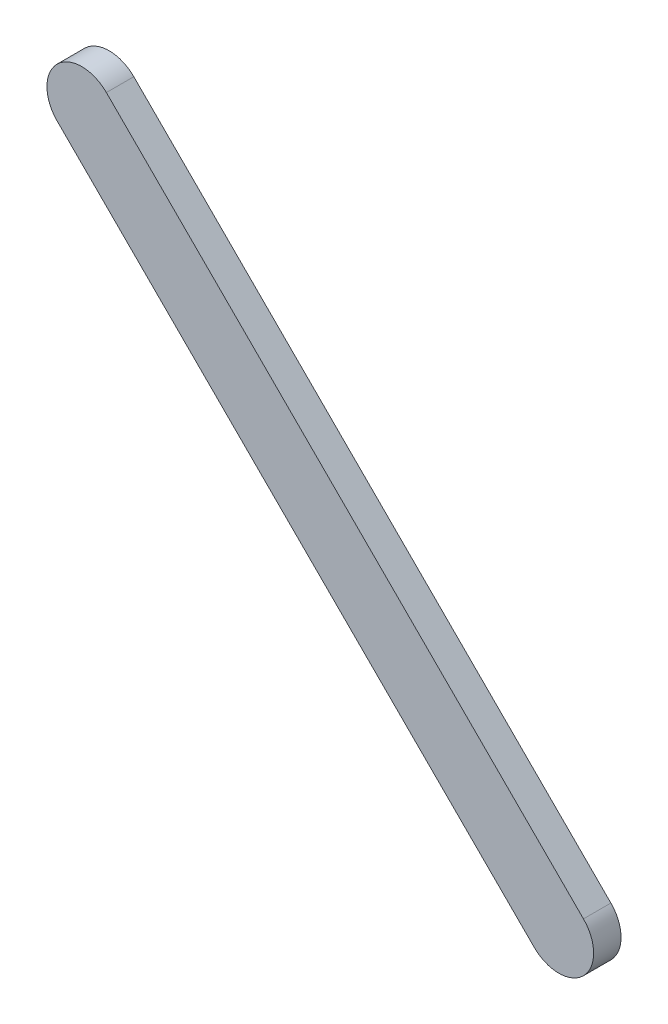
ISO-10303-21;
HEADER;
FILE_DESCRIPTION(('STEP AP214'),'2;1');
FILE_NAME('part.step','',(''),(''),'','','');
FILE_SCHEMA(('AUTOMOTIVE_DESIGN { 1 0 10303 214 1 1 1 1 }'));
ENDSEC;
DATA;
#1=APPLICATION_CONTEXT('core data for automotive mechanical design processes');
#2=APPLICATION_PROTOCOL_DEFINITION('international standard','automotive_design',2000,#1);
#3=PRODUCT_CONTEXT('',#1,'mechanical');
#4=PRODUCT('Part','Part','',(#3));
#5=PRODUCT_RELATED_PRODUCT_CATEGORY('part','',(#4));
#6=PRODUCT_DEFINITION_FORMATION('','',#4);
#7=PRODUCT_DEFINITION_CONTEXT('part definition',#1,'design');
#8=PRODUCT_DEFINITION('design','',#6,#7);
#9=PRODUCT_DEFINITION_SHAPE('','',#8);
#10=(LENGTH_UNIT() NAMED_UNIT(*) SI_UNIT(.MILLI.,.METRE.));
#11=(NAMED_UNIT(*) PLANE_ANGLE_UNIT() SI_UNIT($,.RADIAN.));
#12=(NAMED_UNIT(*) SI_UNIT($,.STERADIAN.) SOLID_ANGLE_UNIT());
#13=UNCERTAINTY_MEASURE_WITH_UNIT(LENGTH_MEASURE(1.E-05),#10,'distance_accuracy_value','');
#14=(GEOMETRIC_REPRESENTATION_CONTEXT(3) GLOBAL_UNCERTAINTY_ASSIGNED_CONTEXT((#13)) GLOBAL_UNIT_ASSIGNED_CONTEXT((#10,
#11,#12)) REPRESENTATION_CONTEXT('',''));
#15=CARTESIAN_POINT('',(0.,0.,0.));
#16=DIRECTION('',(0.,0.,1.));
#17=DIRECTION('',(1.,0.,0.));
#18=AXIS2_PLACEMENT_3D('',#15,#16,#17);
#19=CARTESIAN_POINT('',(133.1195966,107.26239406,0.));
#20=DIRECTION('',(0.707106781186548,0.707106781186548,0.));
#21=DIRECTION('',(0.707106781186548,-0.707106781186548,0.));
#22=AXIS2_PLACEMENT_3D('',#19,#20,#21);
#23=PLANE('',#22);
#24=DIRECTION('',(0.707106781186548,-0.707106781186548,0.));
#25=VECTOR('',#24,1.);
#26=CARTESIAN_POINT('',(133.1195966,107.26239406,0.1999996));
#27=LINE('',#26,#25);
#28=CARTESIAN_POINT('',(133.1195966,107.26239406,0.1999996));
#29=VERTEX_POINT('',#28);
#30=CARTESIAN_POINT('',(136.59939406,103.7825966,0.1999996));
#31=VERTEX_POINT('',#30);
#32=EDGE_CURVE('E11',#29,#31,#27,.T.);
#33=ORIENTED_EDGE('',*,*,#32,.F.);
#34=DIRECTION('',(0.,0.,1.));
#35=VECTOR('',#34,1.);
#36=CARTESIAN_POINT('',(133.1195966,107.26239406,0.));
#37=LINE('',#36,#35);
#38=CARTESIAN_POINT('',(133.1195966,107.26239406,0.));
#39=VERTEX_POINT('',#38);
#40=EDGE_CURVE('E24',#39,#29,#37,.T.);
#41=ORIENTED_EDGE('',*,*,#40,.F.);
#42=DIRECTION('',(0.707106781186548,-0.707106781186548,0.));
#43=VECTOR('',#42,1.);
#44=CARTESIAN_POINT('',(133.1195966,107.26239406,0.));
#45=LINE('',#44,#43);
#46=CARTESIAN_POINT('',(136.59939406,103.7825966,0.));
#47=VERTEX_POINT('',#46);
#48=EDGE_CURVE('E75',#39,#47,#45,.T.);
#49=ORIENTED_EDGE('',*,*,#48,.T.);
#50=DIRECTION('',(0.,0.,1.));
#51=VECTOR('',#50,1.);
#52=CARTESIAN_POINT('',(136.59939406,103.7825966,0.));
#53=LINE('',#52,#51);
#54=EDGE_CURVE('E37',#47,#31,#53,.T.);
#55=ORIENTED_EDGE('',*,*,#54,.T.);
#56=EDGE_LOOP('',(#33,#41,#49,#55));
#57=FACE_BOUND('',#56,.T.);
#58=ADVANCED_FACE('F17',(#57),#23,.F.);
#59=CARTESIAN_POINT('',(136.77899873,103.96220127,0.));
#60=DIRECTION('',(0.,0.,-1.));
#61=DIRECTION('',(-0.707106781186548,-0.707106781186548,0.));
#62=AXIS2_PLACEMENT_3D('',#59,#60,#61);
#63=CYLINDRICAL_SURFACE('',#62,0.253999360179546);
#64=CARTESIAN_POINT('',(136.77899873,103.96220127,0.1999996));
#65=DIRECTION('',(0.,0.,1.));
#66=DIRECTION('',(-0.707106781186548,-0.707106781186548,0.));
#67=AXIS2_PLACEMENT_3D('',#64,#65,#66);
#68=CIRCLE('',#67,0.253999360179546);
#69=CARTESIAN_POINT('',(136.9586034,104.14180594,0.1999996));
#70=VERTEX_POINT('',#69);
#71=EDGE_CURVE('E83',#31,#70,#68,.T.);
#72=ORIENTED_EDGE('',*,*,#71,.F.);
#73=ORIENTED_EDGE('',*,*,#54,.F.);
#74=CARTESIAN_POINT('',(136.77899873,103.96220127,0.));
#75=DIRECTION('',(0.,0.,1.));
#76=DIRECTION('',(-0.707106781186548,-0.707106781186548,0.));
#77=AXIS2_PLACEMENT_3D('',#74,#75,#76);
#78=CIRCLE('',#77,0.253999360179546);
#79=CARTESIAN_POINT('',(136.9586034,104.14180594,0.));
#80=VERTEX_POINT('',#79);
#81=EDGE_CURVE('E81',#47,#80,#78,.T.);
#82=ORIENTED_EDGE('',*,*,#81,.T.);
#83=DIRECTION('',(0.,0.,1.));
#84=VECTOR('',#83,1.);
#85=CARTESIAN_POINT('',(136.9586034,104.14180594,0.));
#86=LINE('',#85,#84);
#87=EDGE_CURVE('E67',#80,#70,#86,.T.);
#88=ORIENTED_EDGE('',*,*,#87,.T.);
#89=EDGE_LOOP('',(#72,#73,#82,#88));
#90=FACE_BOUND('',#89,.T.);
#91=ADVANCED_FACE('F89',(#90),#63,.T.);
#92=CARTESIAN_POINT('',(136.9586034,104.14180594,0.));
#93=DIRECTION('',(-0.707106781186549,-0.707106781186546,0.));
#94=DIRECTION('',(-0.707106781186546,0.707106781186549,0.));
#95=AXIS2_PLACEMENT_3D('',#92,#93,#94);
#96=PLANE('',#95);
#97=DIRECTION('',(-0.707106781186546,0.707106781186549,0.));
#98=VECTOR('',#97,1.);
#99=CARTESIAN_POINT('',(136.9586034,104.14180594,0.1999996));
#100=LINE('',#99,#98);
#101=CARTESIAN_POINT('',(133.47880594,107.6216034,0.1999996));
#102=VERTEX_POINT('',#101);
#103=EDGE_CURVE('E71',#70,#102,#100,.T.);
#104=ORIENTED_EDGE('',*,*,#103,.F.);
#105=ORIENTED_EDGE('',*,*,#87,.F.);
#106=DIRECTION('',(-0.707106781186546,0.707106781186549,0.));
#107=VECTOR('',#106,1.);
#108=CARTESIAN_POINT('',(136.9586034,104.14180594,0.));
#109=LINE('',#108,#107);
#110=CARTESIAN_POINT('',(133.47880594,107.6216034,0.));
#111=VERTEX_POINT('',#110);
#112=EDGE_CURVE('E63',#80,#111,#109,.T.);
#113=ORIENTED_EDGE('',*,*,#112,.T.);
#114=DIRECTION('',(0.,0.,1.));
#115=VECTOR('',#114,1.);
#116=CARTESIAN_POINT('',(133.47880594,107.6216034,0.));
#117=LINE('',#116,#115);
#118=EDGE_CURVE('E53',#111,#102,#117,.T.);
#119=ORIENTED_EDGE('',*,*,#118,.T.);
#120=EDGE_LOOP('',(#104,#105,#113,#119));
#121=FACE_BOUND('',#120,.T.);
#122=ADVANCED_FACE('F66',(#121),#96,.F.);
#123=CARTESIAN_POINT('',(133.29920127,107.44199873,0.));
#124=DIRECTION('',(0.,0.,-1.));
#125=DIRECTION('',(0.707106781186548,0.707106781186548,0.));
#126=AXIS2_PLACEMENT_3D('',#123,#124,#125);
#127=CYLINDRICAL_SURFACE('',#126,0.253999360179549);
#128=CARTESIAN_POINT('',(133.29920127,107.44199873,0.1999996));
#129=DIRECTION('',(0.,0.,1.));
#130=DIRECTION('',(0.707106781186548,0.707106781186548,0.));
#131=AXIS2_PLACEMENT_3D('',#128,#129,#130);
#132=CIRCLE('',#131,0.253999360179549);
#133=EDGE_CURVE('E59',#102,#29,#132,.T.);
#134=ORIENTED_EDGE('',*,*,#133,.F.);
#135=ORIENTED_EDGE('',*,*,#118,.F.);
#136=CARTESIAN_POINT('',(133.29920127,107.44199873,0.));
#137=DIRECTION('',(0.,0.,1.));
#138=DIRECTION('',(0.707106781186548,0.707106781186548,0.));
#139=AXIS2_PLACEMENT_3D('',#136,#137,#138);
#140=CIRCLE('',#139,0.253999360179549);
#141=EDGE_CURVE('E57',#111,#39,#140,.T.);
#142=ORIENTED_EDGE('',*,*,#141,.T.);
#143=ORIENTED_EDGE('',*,*,#40,.T.);
#144=EDGE_LOOP('',(#134,#135,#142,#143));
#145=FACE_BOUND('',#144,.T.);
#146=ADVANCED_FACE('F55',(#145),#127,.T.);
#147=CARTESIAN_POINT('',(133.1195966,107.26239406,0.));
#148=DIRECTION('',(0.,0.,-1.));
#149=DIRECTION('',(-1.,0.,0.));
#150=AXIS2_PLACEMENT_3D('',#147,#148,#149);
#151=PLANE('',#150);
#152=ORIENTED_EDGE('',*,*,#141,.F.);
#153=ORIENTED_EDGE('',*,*,#112,.F.);
#154=ORIENTED_EDGE('',*,*,#81,.F.);
#155=ORIENTED_EDGE('',*,*,#48,.F.);
#156=EDGE_LOOP('',(#152,#153,#154,#155));
#157=FACE_BOUND('',#156,.T.);
#158=ADVANCED_FACE('F74',(#157),#151,.T.);
#159=CARTESIAN_POINT('',(133.1195966,107.26239406,0.1999996));
#160=DIRECTION('',(0.,0.,-1.));
#161=DIRECTION('',(-1.,0.,0.));
#162=AXIS2_PLACEMENT_3D('',#159,#160,#161);
#163=PLANE('',#162);
#164=ORIENTED_EDGE('',*,*,#32,.T.);
#165=ORIENTED_EDGE('',*,*,#71,.T.);
#166=ORIENTED_EDGE('',*,*,#103,.T.);
#167=ORIENTED_EDGE('',*,*,#133,.T.);
#168=EDGE_LOOP('',(#164,#165,#166,#167));
#169=FACE_BOUND('',#168,.T.);
#170=ADVANCED_FACE('F91',(#169),#163,.F.);
#171=CLOSED_SHELL('',(#58,#91,#122,#146,#158,#170));
#172=MANIFOLD_SOLID_BREP('B1',#171);
#173=ADVANCED_BREP_SHAPE_REPRESENTATION('',(#18,#172),#14);
#174=SHAPE_DEFINITION_REPRESENTATION(#9,#173);
ENDSEC;
END-ISO-10303-21;
